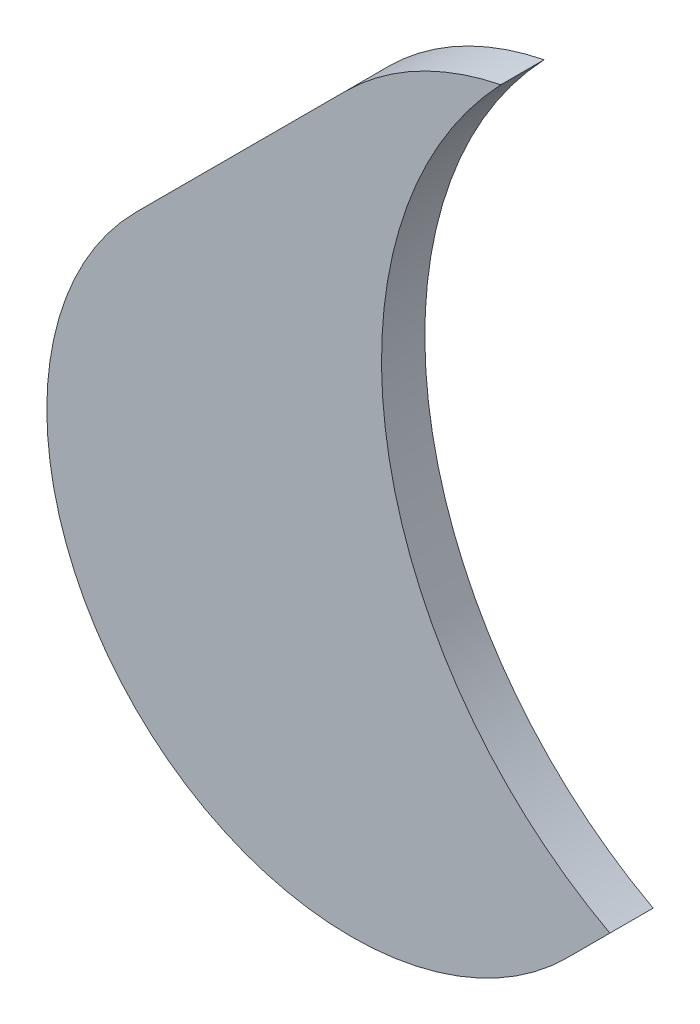
ISO-10303-21;
HEADER;
FILE_DESCRIPTION(('STEP AP214'),'2;1');
FILE_NAME('part.step','',(''),(''),'','','');
FILE_SCHEMA(('AUTOMOTIVE_DESIGN { 1 0 10303 214 1 1 1 1 }'));
ENDSEC;
DATA;
#1=APPLICATION_CONTEXT('core data for automotive mechanical design processes');
#2=APPLICATION_PROTOCOL_DEFINITION('international standard','automotive_design',2000,#1);
#3=PRODUCT_CONTEXT('',#1,'mechanical');
#4=PRODUCT('Part','Part','',(#3));
#5=PRODUCT_RELATED_PRODUCT_CATEGORY('part','',(#4));
#6=PRODUCT_DEFINITION_FORMATION('','',#4);
#7=PRODUCT_DEFINITION_CONTEXT('part definition',#1,'design');
#8=PRODUCT_DEFINITION('design','',#6,#7);
#9=PRODUCT_DEFINITION_SHAPE('','',#8);
#10=(LENGTH_UNIT() NAMED_UNIT(*) SI_UNIT(.MILLI.,.METRE.));
#11=(NAMED_UNIT(*) PLANE_ANGLE_UNIT() SI_UNIT($,.RADIAN.));
#12=(NAMED_UNIT(*) SI_UNIT($,.STERADIAN.) SOLID_ANGLE_UNIT());
#13=UNCERTAINTY_MEASURE_WITH_UNIT(LENGTH_MEASURE(1.E-05),#10,'distance_accuracy_value','');
#14=(GEOMETRIC_REPRESENTATION_CONTEXT(3) GLOBAL_UNCERTAINTY_ASSIGNED_CONTEXT((#13)) GLOBAL_UNIT_ASSIGNED_CONTEXT((#10,
#11,#12)) REPRESENTATION_CONTEXT('',''));
#15=CARTESIAN_POINT('',(0.,0.,0.));
#16=DIRECTION('',(0.,0.,1.));
#17=DIRECTION('',(1.,0.,0.));
#18=AXIS2_PLACEMENT_3D('',#15,#16,#17);
#19=CARTESIAN_POINT('',(62.19642628,104.15123442,0.));
#20=DIRECTION('',(-0.707106781186548,0.707106781186548,0.));
#21=DIRECTION('',(0.707106781186548,0.707106781186548,0.));
#22=AXIS2_PLACEMENT_3D('',#19,#20,#21);
#23=PLANE('',#22);
#24=DIRECTION('',(0.707106781186548,0.707106781186548,0.));
#25=VECTOR('',#24,1.);
#26=CARTESIAN_POINT('',(62.19642628,104.15123442,0.03556));
#27=LINE('',#26,#25);
#28=CARTESIAN_POINT('',(62.19642628,104.15123442,0.03556));
#29=VERTEX_POINT('',#28);
#30=CARTESIAN_POINT('',(62.231855834216,104.186663974216,0.03556));
#31=VERTEX_POINT('',#30);
#32=EDGE_CURVE('E11',#29,#31,#27,.T.);
#33=ORIENTED_EDGE('',*,*,#32,.F.);
#34=DIRECTION('',(0.,0.,1.));
#35=VECTOR('',#34,1.);
#36=CARTESIAN_POINT('',(62.19642628,104.15123442,0.));
#37=LINE('',#36,#35);
#38=CARTESIAN_POINT('',(62.19642628,104.15123442,0.));
#39=VERTEX_POINT('',#38);
#40=EDGE_CURVE('E24',#39,#29,#37,.T.);
#41=ORIENTED_EDGE('',*,*,#40,.F.);
#42=DIRECTION('',(0.707106781186548,0.707106781186548,0.));
#43=VECTOR('',#42,1.);
#44=CARTESIAN_POINT('',(62.19642628,104.15123442,0.));
#45=LINE('',#44,#43);
#46=CARTESIAN_POINT('',(62.231855834216,104.186663974216,0.));
#47=VERTEX_POINT('',#46);
#48=EDGE_CURVE('E82',#39,#47,#45,.T.);
#49=ORIENTED_EDGE('',*,*,#48,.T.);
#50=DIRECTION('',(0.,0.,1.));
#51=VECTOR('',#50,1.);
#52=CARTESIAN_POINT('',(62.231855834216,104.186663974216,0.));
#53=LINE('',#52,#51);
#54=EDGE_CURVE('E37',#47,#31,#53,.T.);
#55=ORIENTED_EDGE('',*,*,#54,.T.);
#56=EDGE_LOOP('',(#33,#41,#49,#55));
#57=FACE_BOUND('',#56,.T.);
#58=ADVANCED_FACE('F17',(#57),#23,.F.);
#59=CARTESIAN_POINT('',(62.39999966,104.49999928,0.));
#60=DIRECTION('',(0.,0.,-1.));
#61=DIRECTION('',(1.,0.,0.));
#62=AXIS2_PLACEMENT_3D('',#59,#60,#61);
#63=CYLINDRICAL_SURFACE('',#62,0.3556);
#64=DIRECTION('',(0.,0.,1.));
#65=VECTOR('',#64,1.);
#66=CARTESIAN_POINT('',(62.1423558070936,104.745093149894,0.));
#67=LINE('',#66,#65);
#68=CARTESIAN_POINT('',(62.1423558070936,104.745093149894,0.));
#69=VERTEX_POINT('',#68);
#70=CARTESIAN_POINT('',(62.1423558070936,104.745093149894,0.03556));
#71=VERTEX_POINT('',#70);
#72=EDGE_CURVE('E98',#69,#71,#67,.T.);
#73=ORIENTED_EDGE('',*,*,#72,.T.);
#74=CARTESIAN_POINT('',(62.39999966,104.49999928,0.03556));
#75=DIRECTION('',(0.,0.,1.));
#76=DIRECTION('',(1.,0.,0.));
#77=AXIS2_PLACEMENT_3D('',#74,#75,#76);
#78=CIRCLE('',#77,0.3556);
#79=EDGE_CURVE('E95',#71,#31,#78,.T.);
#80=ORIENTED_EDGE('',*,*,#79,.T.);
#81=ORIENTED_EDGE('',*,*,#54,.F.);
#82=CARTESIAN_POINT('',(62.39999966,104.49999928,0.));
#83=DIRECTION('',(0.,0.,1.));
#84=DIRECTION('',(1.,0.,0.));
#85=AXIS2_PLACEMENT_3D('',#82,#83,#84);
#86=CIRCLE('',#85,0.3556);
#87=EDGE_CURVE('E93',#69,#47,#86,.T.);
#88=ORIENTED_EDGE('',*,*,#87,.F.);
#89=EDGE_LOOP('',(#73,#80,#81,#88));
#90=FACE_BOUND('',#89,.T.);
#91=ADVANCED_FACE('F103',(#90),#63,.F.);
#92=CARTESIAN_POINT('',(62.19163838,104.49999928,0.));
#93=DIRECTION('',(0.,0.,-1.));
#94=DIRECTION('',(0.707106781186533,-0.707106781186562,0.));
#95=AXIS2_PLACEMENT_3D('',#92,#93,#94);
#96=CYLINDRICAL_SURFACE('',#95,0.249999554103218);
#97=CARTESIAN_POINT('',(62.19163838,104.49999928,0.03556));
#98=DIRECTION('',(0.,0.,1.));
#99=DIRECTION('',(0.707106781186533,-0.707106781186562,0.));
#100=AXIS2_PLACEMENT_3D('',#97,#98,#99);
#101=CIRCLE('',#100,0.249999554103218);
#102=CARTESIAN_POINT('',(62.014862,104.67677566,0.03556));
#103=VERTEX_POINT('',#102);
#104=EDGE_CURVE('E90',#71,#103,#101,.T.);
#105=ORIENTED_EDGE('',*,*,#104,.F.);
#106=ORIENTED_EDGE('',*,*,#72,.F.);
#107=CARTESIAN_POINT('',(62.19163838,104.49999928,0.));
#108=DIRECTION('',(0.,0.,1.));
#109=DIRECTION('',(0.707106781186533,-0.707106781186562,0.));
#110=AXIS2_PLACEMENT_3D('',#107,#108,#109);
#111=CIRCLE('',#110,0.249999554103218);
#112=CARTESIAN_POINT('',(62.014862,104.67677566,0.));
#113=VERTEX_POINT('',#112);
#114=EDGE_CURVE('E88',#69,#113,#111,.T.);
#115=ORIENTED_EDGE('',*,*,#114,.T.);
#116=DIRECTION('',(0.,0.,1.));
#117=VECTOR('',#116,1.);
#118=CARTESIAN_POINT('',(62.014862,104.67677566,0.));
#119=LINE('',#118,#117);
#120=EDGE_CURVE('E73',#113,#103,#119,.T.);
#121=ORIENTED_EDGE('',*,*,#120,.T.);
#122=EDGE_LOOP('',(#105,#106,#115,#121));
#123=FACE_BOUND('',#122,.T.);
#124=ADVANCED_FACE('F109',(#123),#96,.T.);
#125=CARTESIAN_POINT('',(62.014862,104.67677566,0.));
#126=DIRECTION('',(0.707106781186533,-0.707106781186562,0.));
#127=DIRECTION('',(-0.707106781186562,-0.707106781186533,0.));
#128=AXIS2_PLACEMENT_3D('',#125,#126,#127);
#129=PLANE('',#128);
#130=DIRECTION('',(-0.707106781186562,-0.707106781186533,0.));
#131=VECTOR('',#130,1.);
#132=CARTESIAN_POINT('',(62.014862,104.67677566,0.03556));
#133=LINE('',#132,#131);
#134=CARTESIAN_POINT('',(61.84287352,104.50478718,0.03556));
#135=VERTEX_POINT('',#134);
#136=EDGE_CURVE('E77',#103,#135,#133,.T.);
#137=ORIENTED_EDGE('',*,*,#136,.F.);
#138=ORIENTED_EDGE('',*,*,#120,.F.);
#139=DIRECTION('',(-0.707106781186562,-0.707106781186533,0.));
#140=VECTOR('',#139,1.);
#141=CARTESIAN_POINT('',(62.014862,104.67677566,0.));
#142=LINE('',#141,#140);
#143=CARTESIAN_POINT('',(61.84287352,104.50478718,0.));
#144=VERTEX_POINT('',#143);
#145=EDGE_CURVE('E69',#113,#144,#142,.T.);
#146=ORIENTED_EDGE('',*,*,#145,.T.);
#147=DIRECTION('',(0.,0.,1.));
#148=VECTOR('',#147,1.);
#149=CARTESIAN_POINT('',(61.84287352,104.50478718,0.));
#150=LINE('',#149,#148);
#151=EDGE_CURVE('E59',#144,#135,#150,.T.);
#152=ORIENTED_EDGE('',*,*,#151,.T.);
#153=EDGE_LOOP('',(#137,#138,#146,#152));
#154=FACE_BOUND('',#153,.T.);
#155=ADVANCED_FACE('F72',(#154),#129,.F.);
#156=CARTESIAN_POINT('',(62.0196499,104.3280108,0.));
#157=DIRECTION('',(0.,0.,-1.));
#158=DIRECTION('',(-0.707106781186548,0.707106781186548,0.));
#159=AXIS2_PLACEMENT_3D('',#156,#157,#158);
#160=CYLINDRICAL_SURFACE('',#159,0.249999554103221);
#161=CARTESIAN_POINT('',(62.0196499,104.3280108,0.03556));
#162=DIRECTION('',(0.,0.,1.));
#163=DIRECTION('',(-0.707106781186548,0.707106781186548,0.));
#164=AXIS2_PLACEMENT_3D('',#161,#162,#163);
#165=CIRCLE('',#164,0.249999554103221);
#166=EDGE_CURVE('E65',#135,#29,#165,.T.);
#167=ORIENTED_EDGE('',*,*,#166,.F.);
#168=ORIENTED_EDGE('',*,*,#151,.F.);
#169=CARTESIAN_POINT('',(62.0196499,104.3280108,0.));
#170=DIRECTION('',(0.,0.,1.));
#171=DIRECTION('',(-0.707106781186548,0.707106781186548,0.));
#172=AXIS2_PLACEMENT_3D('',#169,#170,#171);
#173=CIRCLE('',#172,0.249999554103221);
#174=EDGE_CURVE('E63',#144,#39,#173,.T.);
#175=ORIENTED_EDGE('',*,*,#174,.T.);
#176=ORIENTED_EDGE('',*,*,#40,.T.);
#177=EDGE_LOOP('',(#167,#168,#175,#176));
#178=FACE_BOUND('',#177,.T.);
#179=ADVANCED_FACE('F61',(#178),#160,.T.);
#180=CARTESIAN_POINT('',(62.19642628,104.15123442,0.));
#181=DIRECTION('',(0.,0.,-1.));
#182=DIRECTION('',(-1.,0.,0.));
#183=AXIS2_PLACEMENT_3D('',#180,#181,#182);
#184=PLANE('',#183);
#185=ORIENTED_EDGE('',*,*,#48,.F.);
#186=ORIENTED_EDGE('',*,*,#174,.F.);
#187=ORIENTED_EDGE('',*,*,#145,.F.);
#188=ORIENTED_EDGE('',*,*,#114,.F.);
#189=ORIENTED_EDGE('',*,*,#87,.T.);
#190=EDGE_LOOP('',(#185,#186,#187,#188,#189));
#191=FACE_BOUND('',#190,.T.);
#192=ADVANCED_FACE('F80',(#191),#184,.T.);
#193=CARTESIAN_POINT('',(62.19642628,104.15123442,0.03556));
#194=DIRECTION('',(0.,0.,-1.));
#195=DIRECTION('',(-1.,0.,0.));
#196=AXIS2_PLACEMENT_3D('',#193,#194,#195);
#197=PLANE('',#196);
#198=ORIENTED_EDGE('',*,*,#166,.T.);
#199=ORIENTED_EDGE('',*,*,#32,.T.);
#200=ORIENTED_EDGE('',*,*,#79,.F.);
#201=ORIENTED_EDGE('',*,*,#104,.T.);
#202=ORIENTED_EDGE('',*,*,#136,.T.);
#203=EDGE_LOOP('',(#198,#199,#200,#201,#202));
#204=FACE_BOUND('',#203,.T.);
#205=ADVANCED_FACE('F107',(#204),#197,.F.);
#206=CLOSED_SHELL('',(#58,#91,#124,#155,#179,#192,#205));
#207=MANIFOLD_SOLID_BREP('B1',#206);
#208=ADVANCED_BREP_SHAPE_REPRESENTATION('',(#18,#207),#14);
#209=SHAPE_DEFINITION_REPRESENTATION(#9,#208);
ENDSEC;
END-ISO-10303-21;
